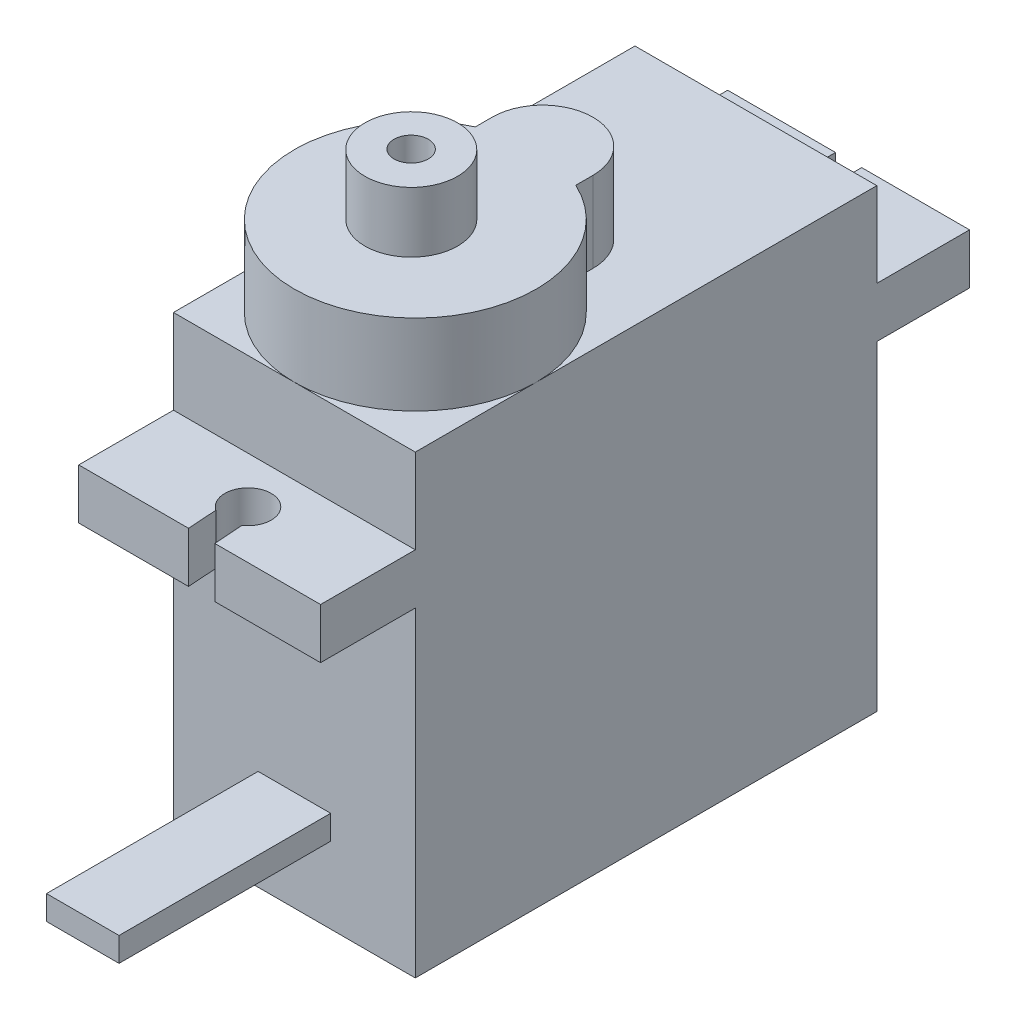
ISO-10303-21;
HEADER;
FILE_DESCRIPTION(('STEP AP214'),'2;1');
FILE_NAME('part.step','',(''),(''),'','','');
FILE_SCHEMA(('AUTOMOTIVE_DESIGN { 1 0 10303 214 1 1 1 1 }'));
ENDSEC;
DATA;
#1=APPLICATION_CONTEXT('core data for automotive mechanical design processes');
#2=APPLICATION_PROTOCOL_DEFINITION('international standard','automotive_design',2000,#1);
#3=PRODUCT_CONTEXT('',#1,'mechanical');
#4=PRODUCT('Part','Part','',(#3));
#5=PRODUCT_RELATED_PRODUCT_CATEGORY('part','',(#4));
#6=PRODUCT_DEFINITION_FORMATION('','',#4);
#7=PRODUCT_DEFINITION_CONTEXT('part definition',#1,'design');
#8=PRODUCT_DEFINITION('design','',#6,#7);
#9=PRODUCT_DEFINITION_SHAPE('','',#8);
#10=(LENGTH_UNIT() NAMED_UNIT(*) SI_UNIT(.MILLI.,.METRE.));
#11=(NAMED_UNIT(*) PLANE_ANGLE_UNIT() SI_UNIT($,.RADIAN.));
#12=(NAMED_UNIT(*) SI_UNIT($,.STERADIAN.) SOLID_ANGLE_UNIT());
#13=UNCERTAINTY_MEASURE_WITH_UNIT(LENGTH_MEASURE(1.E-05),#10,'distance_accuracy_value','');
#14=(GEOMETRIC_REPRESENTATION_CONTEXT(3) GLOBAL_UNCERTAINTY_ASSIGNED_CONTEXT((#13)) GLOBAL_UNIT_ASSIGNED_CONTEXT((#10,
#11,#12)) REPRESENTATION_CONTEXT('',''));
#15=CARTESIAN_POINT('',(0.,0.,0.));
#16=DIRECTION('',(0.,0.,1.));
#17=DIRECTION('',(1.,0.,0.));
#18=AXIS2_PLACEMENT_3D('',#15,#16,#17);
#19=CARTESIAN_POINT('',(0.,22.6,0.));
#20=DIRECTION('',(0.,0.,-1.));
#21=DIRECTION('',(-1.,0.,0.));
#22=AXIS2_PLACEMENT_3D('',#19,#20,#21);
#23=PLANE('',#22);
#24=DIRECTION('',(0.,-1.,0.));
#25=VECTOR('',#24,1.);
#26=CARTESIAN_POINT('',(12.,22.6,0.));
#27=LINE('',#26,#25);
#28=CARTESIAN_POINT('',(12.,15.9,0.));
#29=VERTEX_POINT('',#28);
#30=CARTESIAN_POINT('',(12.,0.,0.));
#31=VERTEX_POINT('',#30);
#32=EDGE_CURVE('E436',#29,#31,#27,.T.);
#33=ORIENTED_EDGE('',*,*,#32,.F.);
#34=DIRECTION('',(-1.,0.,0.));
#35=VECTOR('',#34,1.);
#36=CARTESIAN_POINT('',(0.,15.9,0.));
#37=LINE('',#36,#35);
#38=CARTESIAN_POINT('',(0.,15.9,0.));
#39=VERTEX_POINT('',#38);
#40=EDGE_CURVE('E385',#29,#39,#37,.T.);
#41=ORIENTED_EDGE('',*,*,#40,.T.);
#42=DIRECTION('',(0.,-1.,0.));
#43=VECTOR('',#42,1.);
#44=CARTESIAN_POINT('',(0.,22.6,0.));
#45=LINE('',#44,#43);
#46=CARTESIAN_POINT('',(0.,0.,0.));
#47=VERTEX_POINT('',#46);
#48=EDGE_CURVE('E440',#39,#47,#45,.T.);
#49=ORIENTED_EDGE('',*,*,#48,.T.);
#50=DIRECTION('',(1.,0.,0.));
#51=VECTOR('',#50,1.);
#52=CARTESIAN_POINT('',(0.,0.,0.));
#53=LINE('',#52,#51);
#54=EDGE_CURVE('E420',#47,#31,#53,.T.);
#55=ORIENTED_EDGE('',*,*,#54,.T.);
#56=EDGE_LOOP('',(#33,#41,#49,#55));
#57=FACE_BOUND('',#56,.T.);
#58=DIRECTION('',(0.,-1.,0.));
#59=VECTOR('',#58,1.);
#60=CARTESIAN_POINT('',(4.2,4.97797472526129,0.));
#61=LINE('',#60,#59);
#62=CARTESIAN_POINT('',(4.2,4.97797472526129,0.));
#63=VERTEX_POINT('',#62);
#64=CARTESIAN_POINT('',(4.2,3.77797472526129,0.));
#65=VERTEX_POINT('',#64);
#66=EDGE_CURVE('E252',#63,#65,#61,.T.);
#67=ORIENTED_EDGE('',*,*,#66,.F.);
#68=DIRECTION('',(-1.,0.,0.));
#69=VECTOR('',#68,1.);
#70=CARTESIAN_POINT('',(4.2,4.97797472526129,0.));
#71=LINE('',#70,#69);
#72=CARTESIAN_POINT('',(7.8,4.97797472526128,0.));
#73=VERTEX_POINT('',#72);
#74=EDGE_CURVE('E249',#73,#63,#71,.T.);
#75=ORIENTED_EDGE('',*,*,#74,.F.);
#76=DIRECTION('',(0.,1.,0.));
#77=VECTOR('',#76,1.);
#78=CARTESIAN_POINT('',(7.8,4.97797472526129,0.));
#79=LINE('',#78,#77);
#80=CARTESIAN_POINT('',(7.8,3.77797472526129,0.));
#81=VERTEX_POINT('',#80);
#82=EDGE_CURVE('E58',#81,#73,#79,.T.);
#83=ORIENTED_EDGE('',*,*,#82,.F.);
#84=DIRECTION('',(1.,0.,0.));
#85=VECTOR('',#84,1.);
#86=CARTESIAN_POINT('',(4.2,3.77797472526129,0.));
#87=LINE('',#86,#85);
#88=EDGE_CURVE('E53',#65,#81,#87,.T.);
#89=ORIENTED_EDGE('',*,*,#88,.F.);
#90=EDGE_LOOP('',(#67,#75,#83,#89));
#91=FACE_BOUND('',#90,.T.);
#92=ADVANCED_FACE('F35',(#57,#91),#23,.F.);
#93=CARTESIAN_POINT('',(0.,0.,4.7));
#94=DIRECTION('',(0.,0.,1.));
#95=DIRECTION('',(1.,0.,0.));
#96=AXIS2_PLACEMENT_3D('',#93,#94,#95);
#97=PLANE('',#96);
#98=DIRECTION('',(0.,1.,0.));
#99=VECTOR('',#98,1.);
#100=CARTESIAN_POINT('',(5.45,15.9,4.7));
#101=LINE('',#100,#99);
#102=CARTESIAN_POINT('',(5.45,15.9,4.7));
#103=VERTEX_POINT('',#102);
#104=CARTESIAN_POINT('',(5.45,18.4,4.7));
#105=VERTEX_POINT('',#104);
#106=EDGE_CURVE('E282',#103,#105,#101,.T.);
#107=ORIENTED_EDGE('',*,*,#106,.T.);
#108=DIRECTION('',(-1.,0.,0.));
#109=VECTOR('',#108,1.);
#110=CARTESIAN_POINT('',(0.,18.4,4.7));
#111=LINE('',#110,#109);
#112=CARTESIAN_POINT('',(0.,18.4,4.7));
#113=VERTEX_POINT('',#112);
#114=EDGE_CURVE('E380',#105,#113,#111,.T.);
#115=ORIENTED_EDGE('',*,*,#114,.T.);
#116=DIRECTION('',(0.,-1.,0.));
#117=VECTOR('',#116,1.);
#118=CARTESIAN_POINT('',(0.,18.4,4.7));
#119=LINE('',#118,#117);
#120=CARTESIAN_POINT('',(0.,15.9,4.7));
#121=VERTEX_POINT('',#120);
#122=EDGE_CURVE('E354',#113,#121,#119,.T.);
#123=ORIENTED_EDGE('',*,*,#122,.T.);
#124=DIRECTION('',(1.,0.,0.));
#125=VECTOR('',#124,1.);
#126=CARTESIAN_POINT('',(0.,15.9,4.7));
#127=LINE('',#126,#125);
#128=EDGE_CURVE('E374',#121,#103,#127,.T.);
#129=ORIENTED_EDGE('',*,*,#128,.T.);
#130=EDGE_LOOP('',(#107,#115,#123,#129));
#131=FACE_BOUND('',#130,.T.);
#132=ADVANCED_FACE('F506',(#131),#97,.T.);
#133=CARTESIAN_POINT('',(0.,0.,-27.5));
#134=DIRECTION('',(0.,0.,1.));
#135=DIRECTION('',(1.,0.,0.));
#136=AXIS2_PLACEMENT_3D('',#133,#134,#135);
#137=PLANE('',#136);
#138=DIRECTION('',(-1.,0.,0.));
#139=VECTOR('',#138,1.);
#140=CARTESIAN_POINT('',(0.,18.4,-27.5));
#141=LINE('',#140,#139);
#142=CARTESIAN_POINT('',(5.35,18.4,-27.5));
#143=VERTEX_POINT('',#142);
#144=CARTESIAN_POINT('',(0.,18.4,-27.5));
#145=VERTEX_POINT('',#144);
#146=EDGE_CURVE('E366',#143,#145,#141,.T.);
#147=ORIENTED_EDGE('',*,*,#146,.F.);
#148=DIRECTION('',(0.,1.,0.));
#149=VECTOR('',#148,1.);
#150=CARTESIAN_POINT('',(5.35,15.9,-27.5));
#151=LINE('',#150,#149);
#152=CARTESIAN_POINT('',(5.35,15.9,-27.5));
#153=VERTEX_POINT('',#152);
#154=EDGE_CURVE('E307',#153,#143,#151,.T.);
#155=ORIENTED_EDGE('',*,*,#154,.F.);
#156=DIRECTION('',(1.,0.,0.));
#157=VECTOR('',#156,1.);
#158=CARTESIAN_POINT('',(0.,15.9,-27.5));
#159=LINE('',#158,#157);
#160=CARTESIAN_POINT('',(0.,15.9,-27.5));
#161=VERTEX_POINT('',#160);
#162=EDGE_CURVE('E360',#161,#153,#159,.T.);
#163=ORIENTED_EDGE('',*,*,#162,.F.);
#164=DIRECTION('',(0.,-1.,0.));
#165=VECTOR('',#164,1.);
#166=CARTESIAN_POINT('',(0.,18.4,-27.5));
#167=LINE('',#166,#165);
#168=EDGE_CURVE('E355',#145,#161,#167,.T.);
#169=ORIENTED_EDGE('',*,*,#168,.F.);
#170=EDGE_LOOP('',(#147,#155,#163,#169));
#171=FACE_BOUND('',#170,.T.);
#172=ADVANCED_FACE('F511',(#171),#137,.F.);
#173=CARTESIAN_POINT('',(6.01501718467035,26.6,-12.2999821018924));
#174=DIRECTION('',(0.,1.,0.));
#175=DIRECTION('',(0.,0.,1.));
#176=AXIS2_PLACEMENT_3D('',#173,#174,#175);
#177=PLANE('',#176);
#178=CARTESIAN_POINT('',(6.01501718467035,26.6,-12.2999821018924));
#179=DIRECTION('',(0.,1.,0.));
#180=DIRECTION('',(0.,0.,1.));
#181=AXIS2_PLACEMENT_3D('',#178,#179,#180);
#182=CIRCLE('',#181,2.5);
#183=CARTESIAN_POINT('',(8.51501718467035,26.6,-12.2999821018924));
#184=VERTEX_POINT('',#183);
#185=CARTESIAN_POINT('',(3.51501718467035,26.6,-12.2999821018924));
#186=VERTEX_POINT('',#185);
#187=EDGE_CURVE('E323',#184,#186,#182,.T.);
#188=ORIENTED_EDGE('',*,*,#187,.T.);
#189=DIRECTION('',(0.,0.,1.));
#190=VECTOR('',#189,1.);
#191=CARTESIAN_POINT('',(3.51501718467035,26.6,-12.2999821018924));
#192=LINE('',#191,#190);
#193=CARTESIAN_POINT('',(3.51501718467035,26.6,-11.4612141880278));
#194=VERTEX_POINT('',#193);
#195=EDGE_CURVE('E326',#186,#194,#192,.T.);
#196=ORIENTED_EDGE('',*,*,#195,.T.);
#197=CARTESIAN_POINT('',(6.,26.6,-6.));
#198=DIRECTION('',(0.,1.,0.));
#199=DIRECTION('',(0.,0.,1.));
#200=AXIS2_PLACEMENT_3D('',#197,#198,#199);
#201=CIRCLE('',#200,6.);
#202=CARTESIAN_POINT('',(8.51501718467035,26.6,-11.4474478942724));
#203=VERTEX_POINT('',#202);
#204=EDGE_CURVE('E329',#194,#203,#201,.T.);
#205=ORIENTED_EDGE('',*,*,#204,.T.);
#206=DIRECTION('',(0.,0.,-1.));
#207=VECTOR('',#206,1.);
#208=CARTESIAN_POINT('',(8.51501718467035,26.6,-12.2999821018924));
#209=LINE('',#208,#207);
#210=EDGE_CURVE('E331',#203,#184,#209,.T.);
#211=ORIENTED_EDGE('',*,*,#210,.T.);
#212=EDGE_LOOP('',(#188,#196,#205,#211));
#213=FACE_BOUND('',#212,.T.);
#214=CARTESIAN_POINT('',(5.9,26.6,-5.9));
#215=DIRECTION('',(0.,1.,0.));
#216=DIRECTION('',(0.,0.,1.));
#217=AXIS2_PLACEMENT_3D('',#214,#215,#216);
#218=CIRCLE('',#217,2.3);
#219=CARTESIAN_POINT('',(5.9,26.6,-3.6));
#220=VERTEX_POINT('',#219);
#221=EDGE_CURVE('E309',#220,#220,#218,.T.);
#222=ORIENTED_EDGE('',*,*,#221,.F.);
#223=EDGE_LOOP('',(#222));
#224=FACE_BOUND('',#223,.T.);
#225=ADVANCED_FACE('F465',(#213,#224),#177,.T.);
#226=CARTESIAN_POINT('',(0.,22.6,0.));
#227=DIRECTION('',(0.,-1.,0.));
#228=DIRECTION('',(0.,0.,-1.));
#229=AXIS2_PLACEMENT_3D('',#226,#227,#228);
#230=PLANE('',#229);
#231=CARTESIAN_POINT('',(6.,22.6,-6.));
#232=DIRECTION('',(0.,1.,0.));
#233=DIRECTION('',(0.,0.,1.));
#234=AXIS2_PLACEMENT_3D('',#231,#232,#233);
#235=CIRCLE('',#234,6.);
#236=CARTESIAN_POINT('',(6.,22.6,0.));
#237=VERTEX_POINT('',#236);
#238=CARTESIAN_POINT('',(12.,22.6,-6.));
#239=VERTEX_POINT('',#238);
#240=EDGE_CURVE('E11',#237,#239,#235,.T.);
#241=ORIENTED_EDGE('',*,*,#240,.F.);
#242=DIRECTION('',(1.,0.,0.));
#243=VECTOR('',#242,1.);
#244=CARTESIAN_POINT('',(0.,22.6,0.));
#245=LINE('',#244,#243);
#246=CARTESIAN_POINT('',(12.,22.6,0.));
#247=VERTEX_POINT('',#246);
#248=EDGE_CURVE('E406',#237,#247,#245,.T.);
#249=ORIENTED_EDGE('',*,*,#248,.T.);
#250=DIRECTION('',(0.,0.,-1.));
#251=VECTOR('',#250,1.);
#252=CARTESIAN_POINT('',(12.,22.6,0.));
#253=LINE('',#252,#251);
#254=EDGE_CURVE('E412',#247,#239,#253,.T.);
#255=ORIENTED_EDGE('',*,*,#254,.T.);
#256=EDGE_LOOP('',(#241,#249,#255));
#257=FACE_BOUND('',#256,.T.);
#258=ADVANCED_FACE('F489',(#257),#230,.F.);
#259=CARTESIAN_POINT('',(8.51501718467035,22.6,-11.4474478942724));
#260=VERTEX_POINT('',#259);
#261=EDGE_CURVE('E44',#239,#260,#235,.T.);
#262=ORIENTED_EDGE('',*,*,#261,.F.);
#263=CARTESIAN_POINT('',(12.,22.6,-22.9));
#264=VERTEX_POINT('',#263);
#265=EDGE_CURVE('E411',#239,#264,#253,.T.);
#266=ORIENTED_EDGE('',*,*,#265,.T.);
#267=DIRECTION('',(-1.,0.,0.));
#268=VECTOR('',#267,1.);
#269=CARTESIAN_POINT('',(0.,22.6,-22.9));
#270=LINE('',#269,#268);
#271=CARTESIAN_POINT('',(0.,22.6,-22.9));
#272=VERTEX_POINT('',#271);
#273=EDGE_CURVE('E415',#264,#272,#270,.T.);
#274=ORIENTED_EDGE('',*,*,#273,.T.);
#275=DIRECTION('',(0.,0.,1.));
#276=VECTOR('',#275,1.);
#277=CARTESIAN_POINT('',(0.,22.6,0.));
#278=LINE('',#277,#276);
#279=CARTESIAN_POINT('',(0.,22.6,-6.));
#280=VERTEX_POINT('',#279);
#281=EDGE_CURVE('E403',#272,#280,#278,.T.);
#282=ORIENTED_EDGE('',*,*,#281,.T.);
#283=CARTESIAN_POINT('',(3.51501718467035,22.6,-11.4612141880278));
#284=VERTEX_POINT('',#283);
#285=EDGE_CURVE('E46',#284,#280,#235,.T.);
#286=ORIENTED_EDGE('',*,*,#285,.F.);
#287=DIRECTION('',(0.,0.,1.));
#288=VECTOR('',#287,1.);
#289=CARTESIAN_POINT('',(3.51501718467035,22.6,-12.2999821018924));
#290=LINE('',#289,#288);
#291=CARTESIAN_POINT('',(3.51501718467035,22.6,-12.2999821018924));
#292=VERTEX_POINT('',#291);
#293=EDGE_CURVE('E336',#292,#284,#290,.T.);
#294=ORIENTED_EDGE('',*,*,#293,.F.);
#295=CARTESIAN_POINT('',(6.01501718467035,22.6,-12.2999821018924));
#296=DIRECTION('',(0.,1.,0.));
#297=DIRECTION('',(0.,0.,1.));
#298=AXIS2_PLACEMENT_3D('',#295,#296,#297);
#299=CIRCLE('',#298,2.5);
#300=CARTESIAN_POINT('',(8.51501718467035,22.6,-12.2999821018924));
#301=VERTEX_POINT('',#300);
#302=EDGE_CURVE('E320',#301,#292,#299,.T.);
#303=ORIENTED_EDGE('',*,*,#302,.F.);
#304=DIRECTION('',(0.,0.,-1.));
#305=VECTOR('',#304,1.);
#306=CARTESIAN_POINT('',(8.51501718467035,22.6,-12.2999821018924));
#307=LINE('',#306,#305);
#308=EDGE_CURVE('E327',#260,#301,#307,.T.);
#309=ORIENTED_EDGE('',*,*,#308,.F.);
#310=EDGE_LOOP('',(#262,#266,#274,#282,#286,#294,#303,#309));
#311=FACE_BOUND('',#310,.T.);
#312=ADVANCED_FACE('F471',(#311),#230,.F.);
#313=EDGE_CURVE('E340',#280,#237,#235,.T.);
#314=ORIENTED_EDGE('',*,*,#313,.F.);
#315=CARTESIAN_POINT('',(0.,22.6,0.));
#316=VERTEX_POINT('',#315);
#317=EDGE_CURVE('E407',#280,#316,#278,.T.);
#318=ORIENTED_EDGE('',*,*,#317,.T.);
#319=EDGE_CURVE('E408',#316,#237,#245,.T.);
#320=ORIENTED_EDGE('',*,*,#319,.T.);
#321=EDGE_LOOP('',(#314,#318,#320));
#322=FACE_BOUND('',#321,.T.);
#323=ADVANCED_FACE('F482',(#322),#230,.F.);
#324=CARTESIAN_POINT('',(0.,18.4,0.));
#325=VERTEX_POINT('',#324);
#326=EDGE_CURVE('E441',#316,#325,#45,.T.);
#327=ORIENTED_EDGE('',*,*,#326,.T.);
#328=DIRECTION('',(1.,0.,0.));
#329=VECTOR('',#328,1.);
#330=CARTESIAN_POINT('',(0.,18.4,0.));
#331=LINE('',#330,#329);
#332=CARTESIAN_POINT('',(12.,18.4,0.));
#333=VERTEX_POINT('',#332);
#334=EDGE_CURVE('E399',#325,#333,#331,.T.);
#335=ORIENTED_EDGE('',*,*,#334,.T.);
#336=EDGE_CURVE('E437',#247,#333,#27,.T.);
#337=ORIENTED_EDGE('',*,*,#336,.F.);
#338=ORIENTED_EDGE('',*,*,#248,.F.);
#339=ORIENTED_EDGE('',*,*,#319,.F.);
#340=EDGE_LOOP('',(#327,#335,#337,#338,#339));
#341=FACE_BOUND('',#340,.T.);
#342=ADVANCED_FACE('F485',(#341),#23,.F.);
#343=CARTESIAN_POINT('',(0.,22.6,-22.9));
#344=DIRECTION('',(0.,0.,1.));
#345=DIRECTION('',(1.,0.,0.));
#346=AXIS2_PLACEMENT_3D('',#343,#344,#345);
#347=PLANE('',#346);
#348=DIRECTION('',(0.,-1.,0.));
#349=VECTOR('',#348,1.);
#350=CARTESIAN_POINT('',(12.,22.6,-22.9));
#351=LINE('',#350,#349);
#352=CARTESIAN_POINT('',(12.,18.4,-22.9));
#353=VERTEX_POINT('',#352);
#354=EDGE_CURVE('E433',#264,#353,#351,.T.);
#355=ORIENTED_EDGE('',*,*,#354,.T.);
#356=DIRECTION('',(-1.,0.,0.));
#357=VECTOR('',#356,1.);
#358=CARTESIAN_POINT('',(0.,18.4,-22.9));
#359=LINE('',#358,#357);
#360=CARTESIAN_POINT('',(0.,18.4,-22.9));
#361=VERTEX_POINT('',#360);
#362=EDGE_CURVE('E39',#353,#361,#359,.T.);
#363=ORIENTED_EDGE('',*,*,#362,.T.);
#364=DIRECTION('',(0.,-1.,0.));
#365=VECTOR('',#364,1.);
#366=CARTESIAN_POINT('',(0.,22.6,-22.9));
#367=LINE('',#366,#365);
#368=EDGE_CURVE('E429',#272,#361,#367,.T.);
#369=ORIENTED_EDGE('',*,*,#368,.F.);
#370=ORIENTED_EDGE('',*,*,#273,.F.);
#371=EDGE_LOOP('',(#355,#363,#369,#370));
#372=FACE_BOUND('',#371,.T.);
#373=ADVANCED_FACE('F493',(#372),#347,.F.);
#374=CARTESIAN_POINT('',(0.,22.6,0.));
#375=DIRECTION('',(1.,0.,0.));
#376=DIRECTION('',(0.,0.,-1.));
#377=AXIS2_PLACEMENT_3D('',#374,#375,#376);
#378=PLANE('',#377);
#379=ORIENTED_EDGE('',*,*,#48,.F.);
#380=DIRECTION('',(0.,0.,1.));
#381=VECTOR('',#380,1.);
#382=CARTESIAN_POINT('',(0.,15.9,-27.5));
#383=LINE('',#382,#381);
#384=EDGE_CURVE('E370',#39,#121,#383,.T.);
#385=ORIENTED_EDGE('',*,*,#384,.T.);
#386=ORIENTED_EDGE('',*,*,#122,.F.);
#387=DIRECTION('',(0.,0.,1.));
#388=VECTOR('',#387,1.);
#389=CARTESIAN_POINT('',(0.,18.4,-27.5));
#390=LINE('',#389,#388);
#391=EDGE_CURVE('E386',#325,#113,#390,.T.);
#392=ORIENTED_EDGE('',*,*,#391,.F.);
#393=ORIENTED_EDGE('',*,*,#326,.F.);
#394=ORIENTED_EDGE('',*,*,#317,.F.);
#395=ORIENTED_EDGE('',*,*,#281,.F.);
#396=ORIENTED_EDGE('',*,*,#368,.T.);
#397=EDGE_CURVE('E383',#145,#361,#390,.T.);
#398=ORIENTED_EDGE('',*,*,#397,.F.);
#399=ORIENTED_EDGE('',*,*,#168,.T.);
#400=CARTESIAN_POINT('',(0.,15.9,-22.9));
#401=VERTEX_POINT('',#400);
#402=EDGE_CURVE('E394',#161,#401,#383,.T.);
#403=ORIENTED_EDGE('',*,*,#402,.T.);
#404=CARTESIAN_POINT('',(0.,0.,-22.9));
#405=VERTEX_POINT('',#404);
#406=EDGE_CURVE('E417',#401,#405,#367,.T.);
#407=ORIENTED_EDGE('',*,*,#406,.T.);
#408=DIRECTION('',(0.,0.,1.));
#409=VECTOR('',#408,1.);
#410=CARTESIAN_POINT('',(0.,0.,0.));
#411=LINE('',#410,#409);
#412=EDGE_CURVE('E402',#405,#47,#411,.T.);
#413=ORIENTED_EDGE('',*,*,#412,.T.);
#414=EDGE_LOOP('',(#379,#385,#386,#392,#393,#394,#395,#396,#398,#399,#403,#407,#413));
#415=FACE_BOUND('',#414,.T.);
#416=ADVANCED_FACE('F37',(#415),#378,.F.);
#417=CARTESIAN_POINT('',(12.,22.6,0.));
#418=DIRECTION('',(-1.,0.,0.));
#419=DIRECTION('',(0.,0.,1.));
#420=AXIS2_PLACEMENT_3D('',#417,#418,#419);
#421=PLANE('',#420);
#422=CARTESIAN_POINT('',(12.,15.9,-22.9));
#423=VERTEX_POINT('',#422);
#424=CARTESIAN_POINT('',(12.,0.,-22.9));
#425=VERTEX_POINT('',#424);
#426=EDGE_CURVE('E432',#423,#425,#351,.T.);
#427=ORIENTED_EDGE('',*,*,#426,.F.);
#428=DIRECTION('',(0.,0.,1.));
#429=VECTOR('',#428,1.);
#430=CARTESIAN_POINT('',(12.,15.9,-27.5));
#431=LINE('',#430,#429);
#432=CARTESIAN_POINT('',(12.,15.9,-27.5));
#433=VERTEX_POINT('',#432);
#434=EDGE_CURVE('E391',#433,#423,#431,.T.);
#435=ORIENTED_EDGE('',*,*,#434,.F.);
#436=DIRECTION('',(0.,1.,0.));
#437=VECTOR('',#436,1.);
#438=CARTESIAN_POINT('',(12.,18.4,-27.5));
#439=LINE('',#438,#437);
#440=CARTESIAN_POINT('',(12.,18.4,-27.5));
#441=VERTEX_POINT('',#440);
#442=EDGE_CURVE('E363',#433,#441,#439,.T.);
#443=ORIENTED_EDGE('',*,*,#442,.T.);
#444=DIRECTION('',(0.,0.,1.));
#445=VECTOR('',#444,1.);
#446=CARTESIAN_POINT('',(12.,18.4,-27.5));
#447=LINE('',#446,#445);
#448=EDGE_CURVE('E387',#441,#353,#447,.T.);
#449=ORIENTED_EDGE('',*,*,#448,.T.);
#450=ORIENTED_EDGE('',*,*,#354,.F.);
#451=ORIENTED_EDGE('',*,*,#265,.F.);
#452=ORIENTED_EDGE('',*,*,#254,.F.);
#453=ORIENTED_EDGE('',*,*,#336,.T.);
#454=CARTESIAN_POINT('',(12.,18.4,4.7));
#455=VERTEX_POINT('',#454);
#456=EDGE_CURVE('E390',#333,#455,#447,.T.);
#457=ORIENTED_EDGE('',*,*,#456,.T.);
#458=DIRECTION('',(0.,1.,0.));
#459=VECTOR('',#458,1.);
#460=CARTESIAN_POINT('',(12.,18.4,4.7));
#461=LINE('',#460,#459);
#462=CARTESIAN_POINT('',(12.,15.9,4.7));
#463=VERTEX_POINT('',#462);
#464=EDGE_CURVE('E377',#463,#455,#461,.T.);
#465=ORIENTED_EDGE('',*,*,#464,.F.);
#466=EDGE_CURVE('E393',#29,#463,#431,.T.);
#467=ORIENTED_EDGE('',*,*,#466,.F.);
#468=ORIENTED_EDGE('',*,*,#32,.T.);
#469=DIRECTION('',(0.,0.,-1.));
#470=VECTOR('',#469,1.);
#471=CARTESIAN_POINT('',(12.,0.,0.));
#472=LINE('',#471,#470);
#473=EDGE_CURVE('E423',#31,#425,#472,.T.);
#474=ORIENTED_EDGE('',*,*,#473,.T.);
#475=EDGE_LOOP('',(#427,#435,#443,#449,#450,#451,#452,#453,#457,#465,#467,#468,#474));
#476=FACE_BOUND('',#475,.T.);
#477=ADVANCED_FACE('F491',(#476),#421,.F.);
#478=ORIENTED_EDGE('',*,*,#406,.F.);
#479=DIRECTION('',(1.,0.,0.));
#480=VECTOR('',#479,1.);
#481=CARTESIAN_POINT('',(0.,15.9,-22.9));
#482=LINE('',#481,#480);
#483=EDGE_CURVE('E443',#401,#423,#482,.T.);
#484=ORIENTED_EDGE('',*,*,#483,.T.);
#485=ORIENTED_EDGE('',*,*,#426,.T.);
#486=DIRECTION('',(-1.,0.,0.));
#487=VECTOR('',#486,1.);
#488=CARTESIAN_POINT('',(0.,0.,-22.9));
#489=LINE('',#488,#487);
#490=EDGE_CURVE('E426',#425,#405,#489,.T.);
#491=ORIENTED_EDGE('',*,*,#490,.T.);
#492=EDGE_LOOP('',(#478,#484,#485,#491));
#493=FACE_BOUND('',#492,.T.);
#494=ADVANCED_FACE('F496',(#493),#347,.F.);
#495=CARTESIAN_POINT('',(0.,0.,0.));
#496=DIRECTION('',(0.,-1.,0.));
#497=DIRECTION('',(0.,0.,-1.));
#498=AXIS2_PLACEMENT_3D('',#495,#496,#497);
#499=PLANE('',#498);
#500=ORIENTED_EDGE('',*,*,#412,.F.);
#501=ORIENTED_EDGE('',*,*,#490,.F.);
#502=ORIENTED_EDGE('',*,*,#473,.F.);
#503=ORIENTED_EDGE('',*,*,#54,.F.);
#504=EDGE_LOOP('',(#500,#501,#502,#503));
#505=FACE_BOUND('',#504,.T.);
#506=ADVANCED_FACE('F504',(#505),#499,.T.);
#507=CARTESIAN_POINT('',(6.65,15.9,-27.5));
#508=VERTEX_POINT('',#507);
#509=EDGE_CURVE('E358',#508,#433,#159,.T.);
#510=ORIENTED_EDGE('',*,*,#509,.F.);
#511=DIRECTION('',(0.,1.,0.));
#512=VECTOR('',#511,1.);
#513=CARTESIAN_POINT('',(6.65,15.9,-27.5));
#514=LINE('',#513,#512);
#515=CARTESIAN_POINT('',(6.65,18.4,-27.5));
#516=VERTEX_POINT('',#515);
#517=EDGE_CURVE('E310',#508,#516,#514,.T.);
#518=ORIENTED_EDGE('',*,*,#517,.T.);
#519=EDGE_CURVE('E367',#441,#516,#141,.T.);
#520=ORIENTED_EDGE('',*,*,#519,.F.);
#521=ORIENTED_EDGE('',*,*,#442,.F.);
#522=EDGE_LOOP('',(#510,#518,#520,#521));
#523=FACE_BOUND('',#522,.T.);
#524=ADVANCED_FACE('F534',(#523),#137,.F.);
#525=CARTESIAN_POINT('',(0.,15.9,-27.5));
#526=DIRECTION('',(0.,-1.,0.));
#527=DIRECTION('',(0.,0.,-1.));
#528=AXIS2_PLACEMENT_3D('',#525,#526,#527);
#529=PLANE('',#528);
#530=DIRECTION('',(0.,0.,1.));
#531=VECTOR('',#530,1.);
#532=CARTESIAN_POINT('',(5.35,15.9,-27.5));
#533=LINE('',#532,#531);
#534=CARTESIAN_POINT('',(5.35,15.9,-26.1486832980505));
#535=VERTEX_POINT('',#534);
#536=EDGE_CURVE('E291',#153,#535,#533,.T.);
#537=ORIENTED_EDGE('',*,*,#536,.T.);
#538=CARTESIAN_POINT('',(6.,15.9,-25.2));
#539=DIRECTION('',(0.,1.,0.));
#540=DIRECTION('',(0.,0.,1.));
#541=AXIS2_PLACEMENT_3D('',#538,#539,#540);
#542=CIRCLE('',#541,1.15);
#543=CARTESIAN_POINT('',(6.65,15.9,-26.1486832980505));
#544=VERTEX_POINT('',#543);
#545=EDGE_CURVE('E294',#535,#544,#542,.T.);
#546=ORIENTED_EDGE('',*,*,#545,.T.);
#547=DIRECTION('',(0.,0.,-1.));
#548=VECTOR('',#547,1.);
#549=CARTESIAN_POINT('',(6.65,15.9,-27.5));
#550=LINE('',#549,#548);
#551=EDGE_CURVE('E298',#544,#508,#550,.T.);
#552=ORIENTED_EDGE('',*,*,#551,.T.);
#553=ORIENTED_EDGE('',*,*,#509,.T.);
#554=ORIENTED_EDGE('',*,*,#434,.T.);
#555=ORIENTED_EDGE('',*,*,#483,.F.);
#556=ORIENTED_EDGE('',*,*,#402,.F.);
#557=ORIENTED_EDGE('',*,*,#162,.T.);
#558=EDGE_LOOP('',(#537,#546,#552,#553,#554,#555,#556,#557));
#559=FACE_BOUND('',#558,.T.);
#560=ADVANCED_FACE('F542',(#559),#529,.T.);
#561=CARTESIAN_POINT('',(0.,18.4,-27.5));
#562=DIRECTION('',(0.,1.,0.));
#563=DIRECTION('',(0.,0.,1.));
#564=AXIS2_PLACEMENT_3D('',#561,#562,#563);
#565=PLANE('',#564);
#566=DIRECTION('',(0.,0.,1.));
#567=VECTOR('',#566,1.);
#568=CARTESIAN_POINT('',(5.35,18.4,-27.5));
#569=LINE('',#568,#567);
#570=CARTESIAN_POINT('',(5.35,18.4,-26.1486832980505));
#571=VERTEX_POINT('',#570);
#572=EDGE_CURVE('E285',#143,#571,#569,.T.);
#573=ORIENTED_EDGE('',*,*,#572,.F.);
#574=ORIENTED_EDGE('',*,*,#146,.T.);
#575=ORIENTED_EDGE('',*,*,#397,.T.);
#576=ORIENTED_EDGE('',*,*,#362,.F.);
#577=ORIENTED_EDGE('',*,*,#448,.F.);
#578=ORIENTED_EDGE('',*,*,#519,.T.);
#579=DIRECTION('',(0.,0.,-1.));
#580=VECTOR('',#579,1.);
#581=CARTESIAN_POINT('',(6.65,18.4,-27.5));
#582=LINE('',#581,#580);
#583=CARTESIAN_POINT('',(6.65,18.4,-26.1486832980505));
#584=VERTEX_POINT('',#583);
#585=EDGE_CURVE('E295',#584,#516,#582,.T.);
#586=ORIENTED_EDGE('',*,*,#585,.F.);
#587=CARTESIAN_POINT('',(6.,18.4,-25.2));
#588=DIRECTION('',(0.,1.,0.));
#589=DIRECTION('',(0.,0.,1.));
#590=AXIS2_PLACEMENT_3D('',#587,#588,#589);
#591=CIRCLE('',#590,1.15);
#592=EDGE_CURVE('E303',#571,#584,#591,.T.);
#593=ORIENTED_EDGE('',*,*,#592,.F.);
#594=EDGE_LOOP('',(#573,#574,#575,#576,#577,#578,#586,#593));
#595=FACE_BOUND('',#594,.T.);
#596=ADVANCED_FACE('F551',(#595),#565,.T.);
#597=DIRECTION('',(0.0687399662422271,0.,0.99763461098792));
#598=VECTOR('',#597,1.);
#599=CARTESIAN_POINT('',(5.45,18.4,4.7));
#600=LINE('',#599,#598);
#601=CARTESIAN_POINT('',(5.35,18.4,3.24868329805052));
#602=VERTEX_POINT('',#601);
#603=EDGE_CURVE('E269',#602,#105,#600,.T.);
#604=ORIENTED_EDGE('',*,*,#603,.F.);
#605=CARTESIAN_POINT('',(6.,18.4,2.3));
#606=DIRECTION('',(0.,1.,0.));
#607=DIRECTION('',(0.,0.,-1.));
#608=AXIS2_PLACEMENT_3D('',#605,#606,#607);
#609=CIRCLE('',#608,1.15);
#610=CARTESIAN_POINT('',(6.65,18.4,3.24868329805052));
#611=VERTEX_POINT('',#610);
#612=EDGE_CURVE('E278',#611,#602,#609,.T.);
#613=ORIENTED_EDGE('',*,*,#612,.F.);
#614=DIRECTION('',(-0.0687399662422271,0.,-0.99763461098792));
#615=VECTOR('',#614,1.);
#616=CARTESIAN_POINT('',(6.75,18.4,4.7));
#617=LINE('',#616,#615);
#618=CARTESIAN_POINT('',(6.75,18.4,4.7));
#619=VERTEX_POINT('',#618);
#620=EDGE_CURVE('E263',#619,#611,#617,.T.);
#621=ORIENTED_EDGE('',*,*,#620,.F.);
#622=EDGE_CURVE('E359',#455,#619,#111,.T.);
#623=ORIENTED_EDGE('',*,*,#622,.F.);
#624=ORIENTED_EDGE('',*,*,#456,.F.);
#625=ORIENTED_EDGE('',*,*,#334,.F.);
#626=ORIENTED_EDGE('',*,*,#391,.T.);
#627=ORIENTED_EDGE('',*,*,#114,.F.);
#628=EDGE_LOOP('',(#604,#613,#621,#623,#624,#625,#626,#627));
#629=FACE_BOUND('',#628,.T.);
#630=ADVANCED_FACE('F561',(#629),#565,.T.);
#631=DIRECTION('',(0.0687399662422271,0.,0.99763461098792));
#632=VECTOR('',#631,1.);
#633=CARTESIAN_POINT('',(5.45,15.9,4.7));
#634=LINE('',#633,#632);
#635=CARTESIAN_POINT('',(5.35,15.9,3.24868329805052));
#636=VERTEX_POINT('',#635);
#637=EDGE_CURVE('E272',#636,#103,#634,.T.);
#638=ORIENTED_EDGE('',*,*,#637,.T.);
#639=ORIENTED_EDGE('',*,*,#128,.F.);
#640=ORIENTED_EDGE('',*,*,#384,.F.);
#641=ORIENTED_EDGE('',*,*,#40,.F.);
#642=ORIENTED_EDGE('',*,*,#466,.T.);
#643=CARTESIAN_POINT('',(6.75,15.9,4.7));
#644=VERTEX_POINT('',#643);
#645=EDGE_CURVE('E373',#644,#463,#127,.T.);
#646=ORIENTED_EDGE('',*,*,#645,.F.);
#647=DIRECTION('',(-0.0687399662422271,0.,-0.99763461098792));
#648=VECTOR('',#647,1.);
#649=CARTESIAN_POINT('',(6.75,15.9,4.7));
#650=LINE('',#649,#648);
#651=CARTESIAN_POINT('',(6.65,15.9,3.24868329805052));
#652=VERTEX_POINT('',#651);
#653=EDGE_CURVE('E265',#644,#652,#650,.T.);
#654=ORIENTED_EDGE('',*,*,#653,.T.);
#655=CARTESIAN_POINT('',(6.,15.9,2.3));
#656=DIRECTION('',(0.,1.,0.));
#657=DIRECTION('',(0.,0.,-1.));
#658=AXIS2_PLACEMENT_3D('',#655,#656,#657);
#659=CIRCLE('',#658,1.15);
#660=EDGE_CURVE('E268',#652,#636,#659,.T.);
#661=ORIENTED_EDGE('',*,*,#660,.T.);
#662=EDGE_LOOP('',(#638,#639,#640,#641,#642,#646,#654,#661));
#663=FACE_BOUND('',#662,.T.);
#664=ADVANCED_FACE('F554',(#663),#529,.T.);
#665=DIRECTION('',(0.,1.,0.));
#666=VECTOR('',#665,1.);
#667=CARTESIAN_POINT('',(6.75,15.9,4.7));
#668=LINE('',#667,#666);
#669=EDGE_CURVE('E275',#644,#619,#668,.T.);
#670=ORIENTED_EDGE('',*,*,#669,.F.);
#671=ORIENTED_EDGE('',*,*,#645,.T.);
#672=ORIENTED_EDGE('',*,*,#464,.T.);
#673=ORIENTED_EDGE('',*,*,#622,.T.);
#674=EDGE_LOOP('',(#670,#671,#672,#673));
#675=FACE_BOUND('',#674,.T.);
#676=ADVANCED_FACE('F514',(#675),#97,.T.);
#677=CARTESIAN_POINT('',(6.01501718467035,26.6,-12.2999821018924));
#678=DIRECTION('',(0.,-1.,0.));
#679=DIRECTION('',(0.,0.,-1.));
#680=AXIS2_PLACEMENT_3D('',#677,#678,#679);
#681=CYLINDRICAL_SURFACE('',#680,2.5);
#682=ORIENTED_EDGE('',*,*,#302,.T.);
#683=DIRECTION('',(0.,-1.,0.));
#684=VECTOR('',#683,1.);
#685=CARTESIAN_POINT('',(3.51501718467035,26.6,-12.2999821018924));
#686=LINE('',#685,#684);
#687=EDGE_CURVE('E351',#186,#292,#686,.T.);
#688=ORIENTED_EDGE('',*,*,#687,.F.);
#689=ORIENTED_EDGE('',*,*,#187,.F.);
#690=DIRECTION('',(0.,-1.,0.));
#691=VECTOR('',#690,1.);
#692=CARTESIAN_POINT('',(8.51501718467035,26.6,-12.2999821018924));
#693=LINE('',#692,#691);
#694=EDGE_CURVE('E333',#184,#301,#693,.T.);
#695=ORIENTED_EDGE('',*,*,#694,.T.);
#696=EDGE_LOOP('',(#682,#688,#689,#695));
#697=FACE_BOUND('',#696,.T.);
#698=ADVANCED_FACE('F578',(#697),#681,.T.);
#699=CARTESIAN_POINT('',(3.51501718467035,26.6,-12.2999821018924));
#700=DIRECTION('',(1.,0.,0.));
#701=DIRECTION('',(0.,0.,-1.));
#702=AXIS2_PLACEMENT_3D('',#699,#700,#701);
#703=PLANE('',#702);
#704=ORIENTED_EDGE('',*,*,#293,.T.);
#705=DIRECTION('',(0.,-1.,0.));
#706=VECTOR('',#705,1.);
#707=CARTESIAN_POINT('',(3.51501718467035,26.6,-11.4612141880278));
#708=LINE('',#707,#706);
#709=EDGE_CURVE('E348',#194,#284,#708,.T.);
#710=ORIENTED_EDGE('',*,*,#709,.F.);
#711=ORIENTED_EDGE('',*,*,#195,.F.);
#712=ORIENTED_EDGE('',*,*,#687,.T.);
#713=EDGE_LOOP('',(#704,#710,#711,#712));
#714=FACE_BOUND('',#713,.T.);
#715=ADVANCED_FACE('F470',(#714),#703,.F.);
#716=CARTESIAN_POINT('',(6.,26.6,-6.));
#717=DIRECTION('',(0.,-1.,0.));
#718=DIRECTION('',(0.,0.,-1.));
#719=AXIS2_PLACEMENT_3D('',#716,#717,#718);
#720=CYLINDRICAL_SURFACE('',#719,6.);
#721=ORIENTED_EDGE('',*,*,#285,.T.);
#722=ORIENTED_EDGE('',*,*,#313,.T.);
#723=ORIENTED_EDGE('',*,*,#240,.T.);
#724=ORIENTED_EDGE('',*,*,#261,.T.);
#725=DIRECTION('',(0.,-1.,0.));
#726=VECTOR('',#725,1.);
#727=CARTESIAN_POINT('',(8.51501718467035,26.6,-11.4474478942724));
#728=LINE('',#727,#726);
#729=EDGE_CURVE('E345',#203,#260,#728,.T.);
#730=ORIENTED_EDGE('',*,*,#729,.F.);
#731=ORIENTED_EDGE('',*,*,#204,.F.);
#732=ORIENTED_EDGE('',*,*,#709,.T.);
#733=EDGE_LOOP('',(#721,#722,#723,#724,#730,#731,#732));
#734=FACE_BOUND('',#733,.T.);
#735=ADVANCED_FACE('F455',(#734),#720,.T.);
#736=CARTESIAN_POINT('',(8.51501718467035,26.6,-12.2999821018924));
#737=DIRECTION('',(-1.,0.,0.));
#738=DIRECTION('',(0.,0.,1.));
#739=AXIS2_PLACEMENT_3D('',#736,#737,#738);
#740=PLANE('',#739);
#741=ORIENTED_EDGE('',*,*,#308,.T.);
#742=ORIENTED_EDGE('',*,*,#694,.F.);
#743=ORIENTED_EDGE('',*,*,#210,.F.);
#744=ORIENTED_EDGE('',*,*,#729,.T.);
#745=EDGE_LOOP('',(#741,#742,#743,#744));
#746=FACE_BOUND('',#745,.T.);
#747=ADVANCED_FACE('F461',(#746),#740,.F.);
#748=CARTESIAN_POINT('',(5.9,29.6,-5.9));
#749=DIRECTION('',(0.,-1.,0.));
#750=DIRECTION('',(0.,0.,-1.));
#751=AXIS2_PLACEMENT_3D('',#748,#749,#750);
#752=CYLINDRICAL_SURFACE('',#751,2.3);
#753=CARTESIAN_POINT('',(5.9,29.6,-5.9));
#754=DIRECTION('',(0.,1.,0.));
#755=DIRECTION('',(0.,0.,1.));
#756=AXIS2_PLACEMENT_3D('',#753,#754,#755);
#757=CIRCLE('',#756,2.3);
#758=CARTESIAN_POINT('',(5.9,29.6,-3.6));
#759=VERTEX_POINT('',#758);
#760=EDGE_CURVE('E317',#759,#759,#757,.T.);
#761=ORIENTED_EDGE('',*,*,#760,.F.);
#762=EDGE_LOOP('',(#761));
#763=FACE_BOUND('',#762,.T.);
#764=ORIENTED_EDGE('',*,*,#221,.T.);
#765=EDGE_LOOP('',(#764));
#766=FACE_BOUND('',#765,.T.);
#767=ADVANCED_FACE('F604',(#763,#766),#752,.T.);
#768=CARTESIAN_POINT('',(5.9,29.6,-5.9));
#769=DIRECTION('',(0.,1.,0.));
#770=DIRECTION('',(0.,0.,1.));
#771=AXIS2_PLACEMENT_3D('',#768,#769,#770);
#772=PLANE('',#771);
#773=CARTESIAN_POINT('',(5.87814142038451,29.6,-5.91622847250861));
#774=DIRECTION('',(0.,1.,0.));
#775=DIRECTION('',(0.,0.,1.));
#776=AXIS2_PLACEMENT_3D('',#773,#774,#775);
#777=CIRCLE('',#776,0.85);
#778=CARTESIAN_POINT('',(5.87814142038451,29.6,-5.06622847250861));
#779=VERTEX_POINT('',#778);
#780=EDGE_CURVE('E253',#779,#779,#777,.T.);
#781=ORIENTED_EDGE('',*,*,#780,.F.);
#782=EDGE_LOOP('',(#781));
#783=FACE_BOUND('',#782,.T.);
#784=ORIENTED_EDGE('',*,*,#760,.T.);
#785=EDGE_LOOP('',(#784));
#786=FACE_BOUND('',#785,.T.);
#787=ADVANCED_FACE('F611',(#783,#786),#772,.T.);
#788=CARTESIAN_POINT('',(5.35,15.9,-27.5));
#789=DIRECTION('',(-1.,0.,0.));
#790=DIRECTION('',(0.,0.,1.));
#791=AXIS2_PLACEMENT_3D('',#788,#789,#790);
#792=PLANE('',#791);
#793=ORIENTED_EDGE('',*,*,#572,.T.);
#794=DIRECTION('',(0.,1.,0.));
#795=VECTOR('',#794,1.);
#796=CARTESIAN_POINT('',(5.35,15.9,-26.1486832980505));
#797=LINE('',#796,#795);
#798=EDGE_CURVE('E301',#535,#571,#797,.T.);
#799=ORIENTED_EDGE('',*,*,#798,.F.);
#800=ORIENTED_EDGE('',*,*,#536,.F.);
#801=ORIENTED_EDGE('',*,*,#154,.T.);
#802=EDGE_LOOP('',(#793,#799,#800,#801));
#803=FACE_BOUND('',#802,.T.);
#804=ADVANCED_FACE('F621',(#803),#792,.F.);
#805=CARTESIAN_POINT('',(6.65,15.9,-27.5));
#806=DIRECTION('',(1.,0.,0.));
#807=DIRECTION('',(0.,0.,-1.));
#808=AXIS2_PLACEMENT_3D('',#805,#806,#807);
#809=PLANE('',#808);
#810=ORIENTED_EDGE('',*,*,#585,.T.);
#811=ORIENTED_EDGE('',*,*,#517,.F.);
#812=ORIENTED_EDGE('',*,*,#551,.F.);
#813=DIRECTION('',(0.,1.,0.));
#814=VECTOR('',#813,1.);
#815=CARTESIAN_POINT('',(6.65,15.9,-26.1486832980505));
#816=LINE('',#815,#814);
#817=EDGE_CURVE('E313',#544,#584,#816,.T.);
#818=ORIENTED_EDGE('',*,*,#817,.T.);
#819=EDGE_LOOP('',(#810,#811,#812,#818));
#820=FACE_BOUND('',#819,.T.);
#821=ADVANCED_FACE('F631',(#820),#809,.F.);
#822=CARTESIAN_POINT('',(6.,15.9,-25.2));
#823=DIRECTION('',(0.,1.,0.));
#824=DIRECTION('',(0.,0.,1.));
#825=AXIS2_PLACEMENT_3D('',#822,#823,#824);
#826=CYLINDRICAL_SURFACE('',#825,1.15);
#827=ORIENTED_EDGE('',*,*,#592,.T.);
#828=ORIENTED_EDGE('',*,*,#817,.F.);
#829=ORIENTED_EDGE('',*,*,#545,.F.);
#830=ORIENTED_EDGE('',*,*,#798,.T.);
#831=EDGE_LOOP('',(#827,#828,#829,#830));
#832=FACE_BOUND('',#831,.T.);
#833=ADVANCED_FACE('F639',(#832),#826,.F.);
#834=CARTESIAN_POINT('',(5.45,15.9,4.7));
#835=DIRECTION('',(-0.99763461098792,0.,0.0687399662422271));
#836=DIRECTION('',(0.0687399662422271,0.,0.99763461098792));
#837=AXIS2_PLACEMENT_3D('',#834,#835,#836);
#838=PLANE('',#837);
#839=ORIENTED_EDGE('',*,*,#603,.T.);
#840=ORIENTED_EDGE('',*,*,#106,.F.);
#841=ORIENTED_EDGE('',*,*,#637,.F.);
#842=DIRECTION('',(0.,1.,0.));
#843=VECTOR('',#842,1.);
#844=CARTESIAN_POINT('',(5.35,15.9,3.24868329805052));
#845=LINE('',#844,#843);
#846=EDGE_CURVE('E286',#636,#602,#845,.T.);
#847=ORIENTED_EDGE('',*,*,#846,.T.);
#848=EDGE_LOOP('',(#839,#840,#841,#847));
#849=FACE_BOUND('',#848,.T.);
#850=ADVANCED_FACE('F647',(#849),#838,.F.);
#851=CARTESIAN_POINT('',(6.,15.9,2.3));
#852=DIRECTION('',(0.,1.,0.));
#853=DIRECTION('',(0.,0.,1.));
#854=AXIS2_PLACEMENT_3D('',#851,#852,#853);
#855=CYLINDRICAL_SURFACE('',#854,1.15);
#856=ORIENTED_EDGE('',*,*,#612,.T.);
#857=ORIENTED_EDGE('',*,*,#846,.F.);
#858=ORIENTED_EDGE('',*,*,#660,.F.);
#859=DIRECTION('',(0.,1.,0.));
#860=VECTOR('',#859,1.);
#861=CARTESIAN_POINT('',(6.65,15.9,3.24868329805052));
#862=LINE('',#861,#860);
#863=EDGE_CURVE('E288',#652,#611,#862,.T.);
#864=ORIENTED_EDGE('',*,*,#863,.T.);
#865=EDGE_LOOP('',(#856,#857,#858,#864));
#866=FACE_BOUND('',#865,.T.);
#867=ADVANCED_FACE('F655',(#866),#855,.F.);
#868=CARTESIAN_POINT('',(6.75,15.9,4.7));
#869=DIRECTION('',(0.99763461098792,0.,-0.0687399662422271));
#870=DIRECTION('',(-0.0687399662422271,0.,-0.99763461098792));
#871=AXIS2_PLACEMENT_3D('',#868,#869,#870);
#872=PLANE('',#871);
#873=ORIENTED_EDGE('',*,*,#620,.T.);
#874=ORIENTED_EDGE('',*,*,#863,.F.);
#875=ORIENTED_EDGE('',*,*,#653,.F.);
#876=ORIENTED_EDGE('',*,*,#669,.T.);
#877=EDGE_LOOP('',(#873,#874,#875,#876));
#878=FACE_BOUND('',#877,.T.);
#879=ADVANCED_FACE('F663',(#878),#872,.F.);
#880=CARTESIAN_POINT('',(5.87814142038451,27.1,-5.91622847250861));
#881=DIRECTION('',(0.,1.,0.));
#882=DIRECTION('',(0.,0.,1.));
#883=AXIS2_PLACEMENT_3D('',#880,#881,#882);
#884=CYLINDRICAL_SURFACE('',#883,0.85);
#885=CARTESIAN_POINT('',(5.87814142038451,27.1,-5.91622847250861));
#886=DIRECTION('',(0.,1.,0.));
#887=DIRECTION('',(0.,0.,1.));
#888=AXIS2_PLACEMENT_3D('',#885,#886,#887);
#889=CIRCLE('',#888,0.85);
#890=CARTESIAN_POINT('',(5.87814142038451,27.1,-5.06622847250861));
#891=VERTEX_POINT('',#890);
#892=EDGE_CURVE('E256',#891,#891,#889,.T.);
#893=ORIENTED_EDGE('',*,*,#892,.F.);
#894=EDGE_LOOP('',(#893));
#895=FACE_BOUND('',#894,.T.);
#896=ORIENTED_EDGE('',*,*,#780,.T.);
#897=EDGE_LOOP('',(#896));
#898=FACE_BOUND('',#897,.T.);
#899=ADVANCED_FACE('F670',(#895,#898),#884,.F.);
#900=CARTESIAN_POINT('',(5.87814142038451,27.1,-5.91622847250861));
#901=DIRECTION('',(0.,1.,0.));
#902=DIRECTION('',(0.,0.,1.));
#903=AXIS2_PLACEMENT_3D('',#900,#901,#902);
#904=PLANE('',#903);
#905=ORIENTED_EDGE('',*,*,#892,.T.);
#906=EDGE_LOOP('',(#905));
#907=FACE_BOUND('',#906,.T.);
#908=ADVANCED_FACE('F677',(#907),#904,.T.);
#909=CARTESIAN_POINT('',(4.2,4.97797472526129,10.5));
#910=DIRECTION('',(1.,0.,0.));
#911=DIRECTION('',(0.,0.,-1.));
#912=AXIS2_PLACEMENT_3D('',#909,#910,#911);
#913=PLANE('',#912);
#914=ORIENTED_EDGE('',*,*,#66,.T.);
#915=DIRECTION('',(0.,0.,-1.));
#916=VECTOR('',#915,1.);
#917=CARTESIAN_POINT('',(4.2,3.77797472526129,10.5));
#918=LINE('',#917,#916);
#919=CARTESIAN_POINT('',(4.2,3.77797472526129,10.5));
#920=VERTEX_POINT('',#919);
#921=EDGE_CURVE('E233',#920,#65,#918,.T.);
#922=ORIENTED_EDGE('',*,*,#921,.F.);
#923=DIRECTION('',(0.,-1.,0.));
#924=VECTOR('',#923,1.);
#925=CARTESIAN_POINT('',(4.2,4.97797472526129,10.5));
#926=LINE('',#925,#924);
#927=CARTESIAN_POINT('',(4.2,4.97797472526129,10.5));
#928=VERTEX_POINT('',#927);
#929=EDGE_CURVE('E240',#928,#920,#926,.T.);
#930=ORIENTED_EDGE('',*,*,#929,.F.);
#931=DIRECTION('',(0.,0.,-1.));
#932=VECTOR('',#931,1.);
#933=CARTESIAN_POINT('',(4.2,4.97797472526129,10.5));
#934=LINE('',#933,#932);
#935=EDGE_CURVE('E921',#928,#63,#934,.T.);
#936=ORIENTED_EDGE('',*,*,#935,.T.);
#937=EDGE_LOOP('',(#914,#922,#930,#936));
#938=FACE_BOUND('',#937,.T.);
#939=ADVANCED_FACE('F251',(#938),#913,.F.);
#940=CARTESIAN_POINT('',(4.2,3.77797472526129,10.5));
#941=DIRECTION('',(0.,1.,0.));
#942=DIRECTION('',(0.,0.,1.));
#943=AXIS2_PLACEMENT_3D('',#940,#941,#942);
#944=PLANE('',#943);
#945=ORIENTED_EDGE('',*,*,#88,.T.);
#946=DIRECTION('',(0.,0.,-1.));
#947=VECTOR('',#946,1.);
#948=CARTESIAN_POINT('',(7.8,3.77797472526129,10.5));
#949=LINE('',#948,#947);
#950=CARTESIAN_POINT('',(7.8,3.77797472526129,10.5));
#951=VERTEX_POINT('',#950);
#952=EDGE_CURVE('E236',#951,#81,#949,.T.);
#953=ORIENTED_EDGE('',*,*,#952,.F.);
#954=DIRECTION('',(1.,0.,0.));
#955=VECTOR('',#954,1.);
#956=CARTESIAN_POINT('',(4.2,3.77797472526129,10.5));
#957=LINE('',#956,#955);
#958=EDGE_CURVE('E229',#920,#951,#957,.T.);
#959=ORIENTED_EDGE('',*,*,#958,.F.);
#960=ORIENTED_EDGE('',*,*,#921,.T.);
#961=EDGE_LOOP('',(#945,#953,#959,#960));
#962=FACE_BOUND('',#961,.T.);
#963=ADVANCED_FACE('F231',(#962),#944,.F.);
#964=CARTESIAN_POINT('',(7.8,4.97797472526129,10.5));
#965=DIRECTION('',(-1.,0.,0.));
#966=DIRECTION('',(0.,-1.,0.));
#967=AXIS2_PLACEMENT_3D('',#964,#965,#966);
#968=PLANE('',#967);
#969=ORIENTED_EDGE('',*,*,#82,.T.);
#970=DIRECTION('',(0.,0.,-1.));
#971=VECTOR('',#970,1.);
#972=CARTESIAN_POINT('',(7.8,4.97797472526129,10.5));
#973=LINE('',#972,#971);
#974=CARTESIAN_POINT('',(7.8,4.97797472526129,10.5));
#975=VERTEX_POINT('',#974);
#976=EDGE_CURVE('E258',#975,#73,#973,.T.);
#977=ORIENTED_EDGE('',*,*,#976,.F.);
#978=DIRECTION('',(0.,1.,0.));
#979=VECTOR('',#978,1.);
#980=CARTESIAN_POINT('',(7.8,4.97797472526129,10.5));
#981=LINE('',#980,#979);
#982=EDGE_CURVE('E239',#951,#975,#981,.T.);
#983=ORIENTED_EDGE('',*,*,#982,.F.);
#984=ORIENTED_EDGE('',*,*,#952,.T.);
#985=EDGE_LOOP('',(#969,#977,#983,#984));
#986=FACE_BOUND('',#985,.T.);
#987=ADVANCED_FACE('F699',(#986),#968,.F.);
#988=CARTESIAN_POINT('',(4.2,4.97797472526129,10.5));
#989=DIRECTION('',(0.,-1.,0.));
#990=DIRECTION('',(1.,0.,0.));
#991=AXIS2_PLACEMENT_3D('',#988,#989,#990);
#992=PLANE('',#991);
#993=ORIENTED_EDGE('',*,*,#74,.T.);
#994=ORIENTED_EDGE('',*,*,#935,.F.);
#995=DIRECTION('',(-1.,0.,0.));
#996=VECTOR('',#995,1.);
#997=CARTESIAN_POINT('',(4.2,4.97797472526129,10.5));
#998=LINE('',#997,#996);
#999=EDGE_CURVE('E245',#975,#928,#998,.T.);
#1000=ORIENTED_EDGE('',*,*,#999,.F.);
#1001=ORIENTED_EDGE('',*,*,#976,.T.);
#1002=EDGE_LOOP('',(#993,#994,#1000,#1001));
#1003=FACE_BOUND('',#1002,.T.);
#1004=ADVANCED_FACE('F706',(#1003),#992,.F.);
#1005=CARTESIAN_POINT('',(0.,0.,10.5));
#1006=DIRECTION('',(0.,0.,1.));
#1007=DIRECTION('',(1.,0.,0.));
#1008=AXIS2_PLACEMENT_3D('',#1005,#1006,#1007);
#1009=PLANE('',#1008);
#1010=ORIENTED_EDGE('',*,*,#929,.T.);
#1011=ORIENTED_EDGE('',*,*,#958,.T.);
#1012=ORIENTED_EDGE('',*,*,#982,.T.);
#1013=ORIENTED_EDGE('',*,*,#999,.T.);
#1014=EDGE_LOOP('',(#1010,#1011,#1012,#1013));
#1015=FACE_BOUND('',#1014,.T.);
#1016=ADVANCED_FACE('F243',(#1015),#1009,.T.);
#1017=CLOSED_SHELL('',(#92,#132,#172,#225,#258,#312,#323,#342,#373,#416,#477,#494,#506,#524,
#560,#596,#630,#664,#676,#698,#715,#735,#747,#767,#787,#804,#821,#833,#850,#867,#879,#899,#908,
#939,#963,#987,#1004,#1016));
#1018=MANIFOLD_SOLID_BREP('B2',#1017);
#1019=ADVANCED_BREP_SHAPE_REPRESENTATION('',(#18,#1018),#14);
#1020=SHAPE_DEFINITION_REPRESENTATION(#9,#1019);
ENDSEC;
END-ISO-10303-21;
